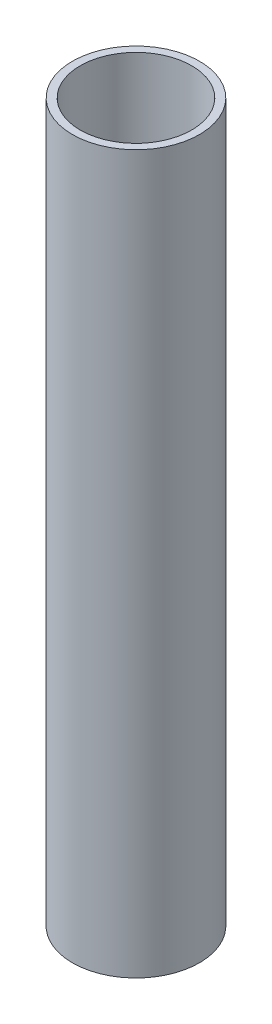
ISO-10303-21;
HEADER;
FILE_DESCRIPTION(('STEP AP214'),'2;1');
FILE_NAME('part.step','',(''),(''),'','','');
FILE_SCHEMA(('AUTOMOTIVE_DESIGN { 1 0 10303 214 1 1 1 1 }'));
ENDSEC;
DATA;
#1=APPLICATION_CONTEXT('core data for automotive mechanical design processes');
#2=APPLICATION_PROTOCOL_DEFINITION('international standard','automotive_design',2000,#1);
#3=PRODUCT_CONTEXT('',#1,'mechanical');
#4=PRODUCT('Part','Part','',(#3));
#5=PRODUCT_RELATED_PRODUCT_CATEGORY('part','',(#4));
#6=PRODUCT_DEFINITION_FORMATION('','',#4);
#7=PRODUCT_DEFINITION_CONTEXT('part definition',#1,'design');
#8=PRODUCT_DEFINITION('design','',#6,#7);
#9=PRODUCT_DEFINITION_SHAPE('','',#8);
#10=(LENGTH_UNIT() NAMED_UNIT(*) SI_UNIT(.MILLI.,.METRE.));
#11=(NAMED_UNIT(*) PLANE_ANGLE_UNIT() SI_UNIT($,.RADIAN.));
#12=(NAMED_UNIT(*) SI_UNIT($,.STERADIAN.) SOLID_ANGLE_UNIT());
#13=UNCERTAINTY_MEASURE_WITH_UNIT(LENGTH_MEASURE(1.E-05),#10,'distance_accuracy_value','');
#14=(GEOMETRIC_REPRESENTATION_CONTEXT(3) GLOBAL_UNCERTAINTY_ASSIGNED_CONTEXT((#13)) GLOBAL_UNIT_ASSIGNED_CONTEXT((#10,
#11,#12)) REPRESENTATION_CONTEXT('',''));
#15=CARTESIAN_POINT('',(0.,0.,0.));
#16=DIRECTION('',(0.,0.,1.));
#17=DIRECTION('',(1.,0.,0.));
#18=AXIS2_PLACEMENT_3D('',#15,#16,#17);
#19=CARTESIAN_POINT('',(0.,35.,0.));
#20=DIRECTION('',(0.,1.,0.));
#21=DIRECTION('',(0.,0.,1.));
#22=AXIS2_PLACEMENT_3D('',#19,#20,#21);
#23=PLANE('',#22);
#24=CARTESIAN_POINT('',(0.,35.,0.));
#25=DIRECTION('',(0.,1.,0.));
#26=DIRECTION('',(0.,0.,1.));
#27=AXIS2_PLACEMENT_3D('',#24,#25,#26);
#28=CIRCLE('',#27,3.1);
#29=CARTESIAN_POINT('',(0.,35.,3.1));
#30=VERTEX_POINT('',#29);
#31=EDGE_CURVE('E10',#30,#30,#28,.T.);
#32=ORIENTED_EDGE('',*,*,#31,.T.);
#33=EDGE_LOOP('',(#32));
#34=FACE_BOUND('',#33,.T.);
#35=CARTESIAN_POINT('',(0.,35.,0.));
#36=DIRECTION('',(0.,1.,0.));
#37=DIRECTION('',(0.,0.,1.));
#38=AXIS2_PLACEMENT_3D('',#35,#36,#37);
#39=CIRCLE('',#38,2.72);
#40=CARTESIAN_POINT('',(0.,35.,2.72));
#41=VERTEX_POINT('',#40);
#42=EDGE_CURVE('E43',#41,#41,#39,.T.);
#43=ORIENTED_EDGE('',*,*,#42,.F.);
#44=EDGE_LOOP('',(#43));
#45=FACE_BOUND('',#44,.T.);
#46=ADVANCED_FACE('F32',(#34,#45),#23,.T.);
#47=CARTESIAN_POINT('',(0.,0.,0.));
#48=DIRECTION('',(0.,1.,0.));
#49=DIRECTION('',(0.,0.,1.));
#50=AXIS2_PLACEMENT_3D('',#47,#48,#49);
#51=PLANE('',#50);
#52=CARTESIAN_POINT('',(0.,0.,0.));
#53=DIRECTION('',(0.,1.,0.));
#54=DIRECTION('',(0.,0.,1.));
#55=AXIS2_PLACEMENT_3D('',#52,#53,#54);
#56=CIRCLE('',#55,3.1);
#57=CARTESIAN_POINT('',(0.,0.,3.1));
#58=VERTEX_POINT('',#57);
#59=EDGE_CURVE('E36',#58,#58,#56,.T.);
#60=ORIENTED_EDGE('',*,*,#59,.F.);
#61=EDGE_LOOP('',(#60));
#62=FACE_BOUND('',#61,.T.);
#63=CARTESIAN_POINT('',(0.,0.,0.));
#64=DIRECTION('',(0.,1.,0.));
#65=DIRECTION('',(0.,0.,1.));
#66=AXIS2_PLACEMENT_3D('',#63,#64,#65);
#67=CIRCLE('',#66,2.72);
#68=CARTESIAN_POINT('',(0.,0.,2.72));
#69=VERTEX_POINT('',#68);
#70=EDGE_CURVE('E45',#69,#69,#67,.T.);
#71=ORIENTED_EDGE('',*,*,#70,.T.);
#72=EDGE_LOOP('',(#71));
#73=FACE_BOUND('',#72,.T.);
#74=ADVANCED_FACE('F55',(#62,#73),#51,.F.);
#75=CARTESIAN_POINT('',(0.,35.,0.));
#76=DIRECTION('',(0.,-1.,0.));
#77=DIRECTION('',(0.,0.,-1.));
#78=AXIS2_PLACEMENT_3D('',#75,#76,#77);
#79=CYLINDRICAL_SURFACE('',#78,3.1);
#80=ORIENTED_EDGE('',*,*,#31,.F.);
#81=EDGE_LOOP('',(#80));
#82=FACE_BOUND('',#81,.T.);
#83=ORIENTED_EDGE('',*,*,#59,.T.);
#84=EDGE_LOOP('',(#83));
#85=FACE_BOUND('',#84,.T.);
#86=ADVANCED_FACE('F34',(#82,#85),#79,.T.);
#87=CARTESIAN_POINT('',(0.,35.,0.));
#88=DIRECTION('',(0.,-1.,0.));
#89=DIRECTION('',(0.,0.,-1.));
#90=AXIS2_PLACEMENT_3D('',#87,#88,#89);
#91=CYLINDRICAL_SURFACE('',#90,2.72);
#92=ORIENTED_EDGE('',*,*,#42,.T.);
#93=EDGE_LOOP('',(#92));
#94=FACE_BOUND('',#93,.T.);
#95=ORIENTED_EDGE('',*,*,#70,.F.);
#96=EDGE_LOOP('',(#95));
#97=FACE_BOUND('',#96,.T.);
#98=ADVANCED_FACE('F51',(#94,#97),#91,.F.);
#99=CLOSED_SHELL('',(#46,#74,#86,#98));
#100=MANIFOLD_SOLID_BREP('B2',#99);
#101=ADVANCED_BREP_SHAPE_REPRESENTATION('',(#18,#100),#14);
#102=SHAPE_DEFINITION_REPRESENTATION(#9,#101);
ENDSEC;
END-ISO-10303-21;
